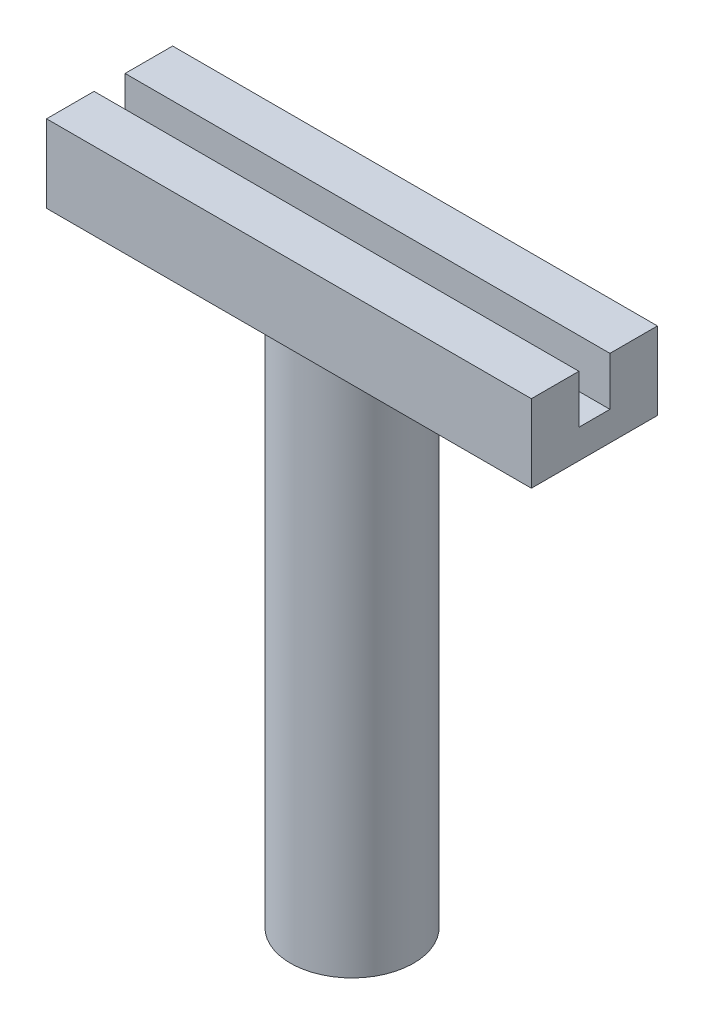
ISO-10303-21;
HEADER;
FILE_DESCRIPTION(('STEP AP214'),'2;1');
FILE_NAME('part.step','',(''),(''),'','','');
FILE_SCHEMA(('AUTOMOTIVE_DESIGN { 1 0 10303 214 1 1 1 1 }'));
ENDSEC;
DATA;
#1=APPLICATION_CONTEXT('core data for automotive mechanical design processes');
#2=APPLICATION_PROTOCOL_DEFINITION('international standard','automotive_design',2000,#1);
#3=PRODUCT_CONTEXT('',#1,'mechanical');
#4=PRODUCT('Part','Part','',(#3));
#5=PRODUCT_RELATED_PRODUCT_CATEGORY('part','',(#4));
#6=PRODUCT_DEFINITION_FORMATION('','',#4);
#7=PRODUCT_DEFINITION_CONTEXT('part definition',#1,'design');
#8=PRODUCT_DEFINITION('design','',#6,#7);
#9=PRODUCT_DEFINITION_SHAPE('','',#8);
#10=(LENGTH_UNIT() NAMED_UNIT(*) SI_UNIT(.MILLI.,.METRE.));
#11=(NAMED_UNIT(*) PLANE_ANGLE_UNIT() SI_UNIT($,.RADIAN.));
#12=(NAMED_UNIT(*) SI_UNIT($,.STERADIAN.) SOLID_ANGLE_UNIT());
#13=UNCERTAINTY_MEASURE_WITH_UNIT(LENGTH_MEASURE(1.E-05),#10,'distance_accuracy_value','');
#14=(GEOMETRIC_REPRESENTATION_CONTEXT(3) GLOBAL_UNCERTAINTY_ASSIGNED_CONTEXT((#13)) GLOBAL_UNIT_ASSIGNED_CONTEXT((#10,
#11,#12)) REPRESENTATION_CONTEXT('',''));
#15=CARTESIAN_POINT('',(0.,0.,0.));
#16=DIRECTION('',(0.,0.,1.));
#17=DIRECTION('',(1.,0.,0.));
#18=AXIS2_PLACEMENT_3D('',#15,#16,#17);
#19=CARTESIAN_POINT('',(0.,8.,0.));
#20=DIRECTION('',(0.,-1.,0.));
#21=DIRECTION('',(0.,0.,-1.));
#22=AXIS2_PLACEMENT_3D('',#19,#20,#21);
#23=PLANE('',#22);
#24=DIRECTION('',(0.,0.,-1.));
#25=VECTOR('',#24,1.);
#26=CARTESIAN_POINT('',(25.,8.,6.5));
#27=LINE('',#26,#25);
#28=CARTESIAN_POINT('',(25.,8.,6.5));
#29=VERTEX_POINT('',#28);
#30=CARTESIAN_POINT('',(25.,8.,1.6));
#31=VERTEX_POINT('',#30);
#32=EDGE_CURVE('E140',#29,#31,#27,.T.);
#33=ORIENTED_EDGE('',*,*,#32,.T.);
#34=DIRECTION('',(1.,0.,0.));
#35=VECTOR('',#34,1.);
#36=CARTESIAN_POINT('',(-25.,8.,1.6));
#37=LINE('',#36,#35);
#38=CARTESIAN_POINT('',(-25.,8.,1.6));
#39=VERTEX_POINT('',#38);
#40=EDGE_CURVE('E126',#39,#31,#37,.T.);
#41=ORIENTED_EDGE('',*,*,#40,.F.);
#42=DIRECTION('',(0.,0.,1.));
#43=VECTOR('',#42,1.);
#44=CARTESIAN_POINT('',(-25.,8.,6.5));
#45=LINE('',#44,#43);
#46=CARTESIAN_POINT('',(-25.,8.,6.5));
#47=VERTEX_POINT('',#46);
#48=EDGE_CURVE('E144',#39,#47,#45,.T.);
#49=ORIENTED_EDGE('',*,*,#48,.T.);
#50=DIRECTION('',(1.,0.,0.));
#51=VECTOR('',#50,1.);
#52=CARTESIAN_POINT('',(-25.,8.,6.5));
#53=LINE('',#52,#51);
#54=EDGE_CURVE('E60',#47,#29,#53,.T.);
#55=ORIENTED_EDGE('',*,*,#54,.T.);
#56=EDGE_LOOP('',(#33,#41,#49,#55));
#57=FACE_BOUND('',#56,.T.);
#58=ADVANCED_FACE('F35',(#57),#23,.F.);
#59=CARTESIAN_POINT('',(25.,8.,6.5));
#60=DIRECTION('',(-1.,0.,0.));
#61=DIRECTION('',(0.,0.,1.));
#62=AXIS2_PLACEMENT_3D('',#59,#60,#61);
#63=PLANE('',#62);
#64=DIRECTION('',(0.,0.,-1.));
#65=VECTOR('',#64,1.);
#66=CARTESIAN_POINT('',(25.,3.,1.6));
#67=LINE('',#66,#65);
#68=CARTESIAN_POINT('',(25.,3.,1.6));
#69=VERTEX_POINT('',#68);
#70=CARTESIAN_POINT('',(25.,3.,-1.6));
#71=VERTEX_POINT('',#70);
#72=EDGE_CURVE('E117',#69,#71,#67,.T.);
#73=ORIENTED_EDGE('',*,*,#72,.F.);
#74=DIRECTION('',(0.,1.,0.));
#75=VECTOR('',#74,1.);
#76=CARTESIAN_POINT('',(25.,3.,1.6));
#77=LINE('',#76,#75);
#78=EDGE_CURVE('E138',#69,#31,#77,.T.);
#79=ORIENTED_EDGE('',*,*,#78,.T.);
#80=ORIENTED_EDGE('',*,*,#32,.F.);
#81=DIRECTION('',(0.,-1.,0.));
#82=VECTOR('',#81,1.);
#83=CARTESIAN_POINT('',(25.,8.,6.5));
#84=LINE('',#83,#82);
#85=CARTESIAN_POINT('',(25.,0.,6.5));
#86=VERTEX_POINT('',#85);
#87=EDGE_CURVE('E149',#29,#86,#84,.T.);
#88=ORIENTED_EDGE('',*,*,#87,.T.);
#89=DIRECTION('',(0.,0.,-1.));
#90=VECTOR('',#89,1.);
#91=CARTESIAN_POINT('',(25.,0.,6.5));
#92=LINE('',#91,#90);
#93=CARTESIAN_POINT('',(25.,0.,-6.5));
#94=VERTEX_POINT('',#93);
#95=EDGE_CURVE('E137',#86,#94,#92,.T.);
#96=ORIENTED_EDGE('',*,*,#95,.T.);
#97=DIRECTION('',(0.,-1.,0.));
#98=VECTOR('',#97,1.);
#99=CARTESIAN_POINT('',(25.,8.,-6.5));
#100=LINE('',#99,#98);
#101=CARTESIAN_POINT('',(25.,8.,-6.5));
#102=VERTEX_POINT('',#101);
#103=EDGE_CURVE('E39',#102,#94,#100,.T.);
#104=ORIENTED_EDGE('',*,*,#103,.F.);
#105=CARTESIAN_POINT('',(25.,8.,-1.6));
#106=VERTEX_POINT('',#105);
#107=EDGE_CURVE('E88',#106,#102,#27,.T.);
#108=ORIENTED_EDGE('',*,*,#107,.F.);
#109=DIRECTION('',(0.,1.,0.));
#110=VECTOR('',#109,1.);
#111=CARTESIAN_POINT('',(25.,3.,-1.6));
#112=LINE('',#111,#110);
#113=EDGE_CURVE('E51',#71,#106,#112,.T.);
#114=ORIENTED_EDGE('',*,*,#113,.F.);
#115=EDGE_LOOP('',(#73,#79,#80,#88,#96,#104,#108,#114));
#116=FACE_BOUND('',#115,.T.);
#117=ADVANCED_FACE('F37',(#116),#63,.F.);
#118=CARTESIAN_POINT('',(-25.,8.,-6.5));
#119=DIRECTION('',(0.,0.,1.));
#120=DIRECTION('',(1.,0.,0.));
#121=AXIS2_PLACEMENT_3D('',#118,#119,#120);
#122=PLANE('',#121);
#123=DIRECTION('',(-1.,0.,0.));
#124=VECTOR('',#123,1.);
#125=CARTESIAN_POINT('',(-25.,0.,-6.5));
#126=LINE('',#125,#124);
#127=CARTESIAN_POINT('',(-25.,0.,-6.5));
#128=VERTEX_POINT('',#127);
#129=EDGE_CURVE('E152',#94,#128,#126,.T.);
#130=ORIENTED_EDGE('',*,*,#129,.T.);
#131=DIRECTION('',(0.,-1.,0.));
#132=VECTOR('',#131,1.);
#133=CARTESIAN_POINT('',(-25.,8.,-6.5));
#134=LINE('',#133,#132);
#135=CARTESIAN_POINT('',(-25.,8.,-6.5));
#136=VERTEX_POINT('',#135);
#137=EDGE_CURVE('E159',#136,#128,#134,.T.);
#138=ORIENTED_EDGE('',*,*,#137,.F.);
#139=DIRECTION('',(-1.,0.,0.));
#140=VECTOR('',#139,1.);
#141=CARTESIAN_POINT('',(-25.,8.,-6.5));
#142=LINE('',#141,#140);
#143=EDGE_CURVE('E142',#102,#136,#142,.T.);
#144=ORIENTED_EDGE('',*,*,#143,.F.);
#145=ORIENTED_EDGE('',*,*,#103,.T.);
#146=EDGE_LOOP('',(#130,#138,#144,#145));
#147=FACE_BOUND('',#146,.T.);
#148=ADVANCED_FACE('F167',(#147),#122,.F.);
#149=CARTESIAN_POINT('',(-25.,8.,6.5));
#150=DIRECTION('',(1.,0.,0.));
#151=DIRECTION('',(0.,0.,-1.));
#152=AXIS2_PLACEMENT_3D('',#149,#150,#151);
#153=PLANE('',#152);
#154=ORIENTED_EDGE('',*,*,#48,.F.);
#155=DIRECTION('',(0.,1.,0.));
#156=VECTOR('',#155,1.);
#157=CARTESIAN_POINT('',(-25.,3.,1.6));
#158=LINE('',#157,#156);
#159=CARTESIAN_POINT('',(-25.,3.,1.6));
#160=VERTEX_POINT('',#159);
#161=EDGE_CURVE('E130',#160,#39,#158,.T.);
#162=ORIENTED_EDGE('',*,*,#161,.F.);
#163=DIRECTION('',(0.,0.,1.));
#164=VECTOR('',#163,1.);
#165=CARTESIAN_POINT('',(-25.,3.,1.6));
#166=LINE('',#165,#164);
#167=CARTESIAN_POINT('',(-25.,3.,-1.6));
#168=VERTEX_POINT('',#167);
#169=EDGE_CURVE('E116',#168,#160,#166,.T.);
#170=ORIENTED_EDGE('',*,*,#169,.F.);
#171=DIRECTION('',(0.,1.,0.));
#172=VECTOR('',#171,1.);
#173=CARTESIAN_POINT('',(-25.,3.,-1.6));
#174=LINE('',#173,#172);
#175=CARTESIAN_POINT('',(-25.,8.,-1.6));
#176=VERTEX_POINT('',#175);
#177=EDGE_CURVE('E113',#168,#176,#174,.T.);
#178=ORIENTED_EDGE('',*,*,#177,.T.);
#179=EDGE_CURVE('E145',#136,#176,#45,.T.);
#180=ORIENTED_EDGE('',*,*,#179,.F.);
#181=ORIENTED_EDGE('',*,*,#137,.T.);
#182=DIRECTION('',(0.,0.,1.));
#183=VECTOR('',#182,1.);
#184=CARTESIAN_POINT('',(-25.,0.,6.5));
#185=LINE('',#184,#183);
#186=CARTESIAN_POINT('',(-25.,0.,6.5));
#187=VERTEX_POINT('',#186);
#188=EDGE_CURVE('E154',#128,#187,#185,.T.);
#189=ORIENTED_EDGE('',*,*,#188,.T.);
#190=DIRECTION('',(0.,-1.,0.));
#191=VECTOR('',#190,1.);
#192=CARTESIAN_POINT('',(-25.,8.,6.5));
#193=LINE('',#192,#191);
#194=EDGE_CURVE('E158',#47,#187,#193,.T.);
#195=ORIENTED_EDGE('',*,*,#194,.F.);
#196=EDGE_LOOP('',(#154,#162,#170,#178,#180,#181,#189,#195));
#197=FACE_BOUND('',#196,.T.);
#198=ADVANCED_FACE('F174',(#197),#153,.F.);
#199=CARTESIAN_POINT('',(-25.,8.,6.5));
#200=DIRECTION('',(0.,0.,-1.));
#201=DIRECTION('',(-1.,0.,0.));
#202=AXIS2_PLACEMENT_3D('',#199,#200,#201);
#203=PLANE('',#202);
#204=DIRECTION('',(1.,0.,0.));
#205=VECTOR('',#204,1.);
#206=CARTESIAN_POINT('',(-25.,0.,6.5));
#207=LINE('',#206,#205);
#208=EDGE_CURVE('E81',#187,#86,#207,.T.);
#209=ORIENTED_EDGE('',*,*,#208,.T.);
#210=ORIENTED_EDGE('',*,*,#87,.F.);
#211=ORIENTED_EDGE('',*,*,#54,.F.);
#212=ORIENTED_EDGE('',*,*,#194,.T.);
#213=EDGE_LOOP('',(#209,#210,#211,#212));
#214=FACE_BOUND('',#213,.T.);
#215=ADVANCED_FACE('F175',(#214),#203,.F.);
#216=ORIENTED_EDGE('',*,*,#179,.T.);
#217=DIRECTION('',(-1.,0.,0.));
#218=VECTOR('',#217,1.);
#219=CARTESIAN_POINT('',(-25.,8.,-1.6));
#220=LINE('',#219,#218);
#221=EDGE_CURVE('E178',#106,#176,#220,.T.);
#222=ORIENTED_EDGE('',*,*,#221,.F.);
#223=ORIENTED_EDGE('',*,*,#107,.T.);
#224=ORIENTED_EDGE('',*,*,#143,.T.);
#225=EDGE_LOOP('',(#216,#222,#223,#224));
#226=FACE_BOUND('',#225,.T.);
#227=ADVANCED_FACE('F199',(#226),#23,.F.);
#228=CARTESIAN_POINT('',(0.,0.,0.));
#229=DIRECTION('',(0.,-1.,0.));
#230=DIRECTION('',(0.,0.,-1.));
#231=AXIS2_PLACEMENT_3D('',#228,#229,#230);
#232=PLANE('',#231);
#233=CARTESIAN_POINT('',(0.,0.,0.));
#234=DIRECTION('',(0.,-1.,0.));
#235=DIRECTION('',(0.,0.,-1.));
#236=AXIS2_PLACEMENT_3D('',#233,#234,#235);
#237=CIRCLE('',#236,6.35);
#238=CARTESIAN_POINT('',(0.,0.,-6.35));
#239=VERTEX_POINT('',#238);
#240=EDGE_CURVE('E11',#239,#239,#237,.T.);
#241=ORIENTED_EDGE('',*,*,#240,.F.);
#242=EDGE_LOOP('',(#241));
#243=FACE_BOUND('',#242,.T.);
#244=ORIENTED_EDGE('',*,*,#95,.F.);
#245=ORIENTED_EDGE('',*,*,#208,.F.);
#246=ORIENTED_EDGE('',*,*,#188,.F.);
#247=ORIENTED_EDGE('',*,*,#129,.F.);
#248=EDGE_LOOP('',(#244,#245,#246,#247));
#249=FACE_BOUND('',#248,.T.);
#250=ADVANCED_FACE('F171',(#243,#249),#232,.T.);
#251=CARTESIAN_POINT('',(0.,-55.,0.));
#252=DIRECTION('',(0.,1.,0.));
#253=DIRECTION('',(0.,0.,1.));
#254=AXIS2_PLACEMENT_3D('',#251,#252,#253);
#255=CYLINDRICAL_SURFACE('',#254,6.35);
#256=CARTESIAN_POINT('',(0.,-55.,0.));
#257=DIRECTION('',(0.,-1.,0.));
#258=DIRECTION('',(0.,0.,-1.));
#259=AXIS2_PLACEMENT_3D('',#256,#257,#258);
#260=CIRCLE('',#259,6.35);
#261=CARTESIAN_POINT('',(0.,-55.,-6.35));
#262=VERTEX_POINT('',#261);
#263=EDGE_CURVE('E135',#262,#262,#260,.T.);
#264=ORIENTED_EDGE('',*,*,#263,.F.);
#265=EDGE_LOOP('',(#264));
#266=FACE_BOUND('',#265,.T.);
#267=ORIENTED_EDGE('',*,*,#240,.T.);
#268=EDGE_LOOP('',(#267));
#269=FACE_BOUND('',#268,.T.);
#270=ADVANCED_FACE('F193',(#266,#269),#255,.T.);
#271=CARTESIAN_POINT('',(0.,-55.,0.));
#272=DIRECTION('',(0.,-1.,0.));
#273=DIRECTION('',(0.,0.,-1.));
#274=AXIS2_PLACEMENT_3D('',#271,#272,#273);
#275=PLANE('',#274);
#276=ORIENTED_EDGE('',*,*,#263,.T.);
#277=EDGE_LOOP('',(#276));
#278=FACE_BOUND('',#277,.T.);
#279=ADVANCED_FACE('F186',(#278),#275,.T.);
#280=CARTESIAN_POINT('',(-25.,3.,1.6));
#281=DIRECTION('',(0.,0.,1.));
#282=DIRECTION('',(1.,0.,0.));
#283=AXIS2_PLACEMENT_3D('',#280,#281,#282);
#284=PLANE('',#283);
#285=ORIENTED_EDGE('',*,*,#40,.T.);
#286=ORIENTED_EDGE('',*,*,#78,.F.);
#287=DIRECTION('',(1.,0.,0.));
#288=VECTOR('',#287,1.);
#289=CARTESIAN_POINT('',(-25.,3.,1.6));
#290=LINE('',#289,#288);
#291=EDGE_CURVE('E123',#160,#69,#290,.T.);
#292=ORIENTED_EDGE('',*,*,#291,.F.);
#293=ORIENTED_EDGE('',*,*,#161,.T.);
#294=EDGE_LOOP('',(#285,#286,#292,#293));
#295=FACE_BOUND('',#294,.T.);
#296=ADVANCED_FACE('F184',(#295),#284,.F.);
#297=CARTESIAN_POINT('',(-25.,3.,-1.6));
#298=DIRECTION('',(0.,0.,-1.));
#299=DIRECTION('',(-1.,0.,0.));
#300=AXIS2_PLACEMENT_3D('',#297,#298,#299);
#301=PLANE('',#300);
#302=ORIENTED_EDGE('',*,*,#221,.T.);
#303=ORIENTED_EDGE('',*,*,#177,.F.);
#304=DIRECTION('',(-1.,0.,0.));
#305=VECTOR('',#304,1.);
#306=CARTESIAN_POINT('',(-25.,3.,-1.6));
#307=LINE('',#306,#305);
#308=EDGE_CURVE('E109',#71,#168,#307,.T.);
#309=ORIENTED_EDGE('',*,*,#308,.F.);
#310=ORIENTED_EDGE('',*,*,#113,.T.);
#311=EDGE_LOOP('',(#302,#303,#309,#310));
#312=FACE_BOUND('',#311,.T.);
#313=ADVANCED_FACE('F111',(#312),#301,.F.);
#314=CARTESIAN_POINT('',(0.,3.,0.));
#315=DIRECTION('',(0.,-1.,0.));
#316=DIRECTION('',(0.,0.,-1.));
#317=AXIS2_PLACEMENT_3D('',#314,#315,#316);
#318=PLANE('',#317);
#319=ORIENTED_EDGE('',*,*,#72,.T.);
#320=ORIENTED_EDGE('',*,*,#308,.T.);
#321=ORIENTED_EDGE('',*,*,#169,.T.);
#322=ORIENTED_EDGE('',*,*,#291,.T.);
#323=EDGE_LOOP('',(#319,#320,#321,#322));
#324=FACE_BOUND('',#323,.T.);
#325=ADVANCED_FACE('F121',(#324),#318,.F.);
#326=CLOSED_SHELL('',(#58,#117,#148,#198,#215,#227,#250,#270,#279,#296,#313,#325));
#327=MANIFOLD_SOLID_BREP('B2',#326);
#328=ADVANCED_BREP_SHAPE_REPRESENTATION('',(#18,#327),#14);
#329=SHAPE_DEFINITION_REPRESENTATION(#9,#328);
ENDSEC;
END-ISO-10303-21;
